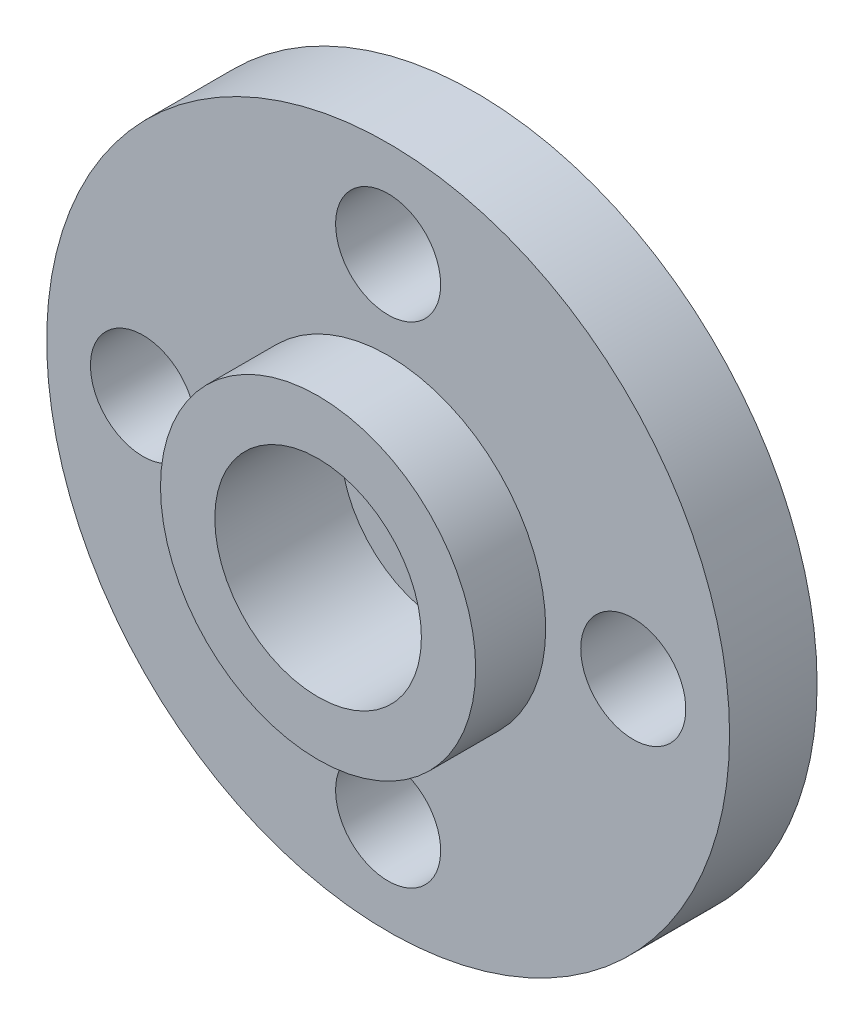
ISO-10303-21;
HEADER;
FILE_DESCRIPTION(('STEP AP214'),'2;1');
FILE_NAME('part.step','',(''),(''),'','','');
FILE_SCHEMA(('AUTOMOTIVE_DESIGN { 1 0 10303 214 1 1 1 1 }'));
ENDSEC;
DATA;
#1=APPLICATION_CONTEXT('core data for automotive mechanical design processes');
#2=APPLICATION_PROTOCOL_DEFINITION('international standard','automotive_design',2000,#1);
#3=PRODUCT_CONTEXT('',#1,'mechanical');
#4=PRODUCT('Part','Part','',(#3));
#5=PRODUCT_RELATED_PRODUCT_CATEGORY('part','',(#4));
#6=PRODUCT_DEFINITION_FORMATION('','',#4);
#7=PRODUCT_DEFINITION_CONTEXT('part definition',#1,'design');
#8=PRODUCT_DEFINITION('design','',#6,#7);
#9=PRODUCT_DEFINITION_SHAPE('','',#8);
#10=(LENGTH_UNIT() NAMED_UNIT(*) SI_UNIT(.MILLI.,.METRE.));
#11=(NAMED_UNIT(*) PLANE_ANGLE_UNIT() SI_UNIT($,.RADIAN.));
#12=(NAMED_UNIT(*) SI_UNIT($,.STERADIAN.) SOLID_ANGLE_UNIT());
#13=UNCERTAINTY_MEASURE_WITH_UNIT(LENGTH_MEASURE(1.E-05),#10,'distance_accuracy_value','');
#14=(GEOMETRIC_REPRESENTATION_CONTEXT(3) GLOBAL_UNCERTAINTY_ASSIGNED_CONTEXT((#13)) GLOBAL_UNIT_ASSIGNED_CONTEXT((#10,
#11,#12)) REPRESENTATION_CONTEXT('',''));
#15=CARTESIAN_POINT('',(0.,0.,0.));
#16=DIRECTION('',(0.,0.,1.));
#17=DIRECTION('',(1.,0.,0.));
#18=AXIS2_PLACEMENT_3D('',#15,#16,#17);
#19=CARTESIAN_POINT('',(0.,0.,2.5));
#20=DIRECTION('',(0.,0.,-1.));
#21=DIRECTION('',(-1.,0.,0.));
#22=AXIS2_PLACEMENT_3D('',#19,#20,#21);
#23=CYLINDRICAL_SURFACE('',#22,9.75);
#24=CARTESIAN_POINT('',(0.,0.,2.5));
#25=DIRECTION('',(0.,0.,1.));
#26=DIRECTION('',(1.,0.,0.));
#27=AXIS2_PLACEMENT_3D('',#24,#25,#26);
#28=CIRCLE('',#27,9.75);
#29=CARTESIAN_POINT('',(9.75,0.,2.5));
#30=VERTEX_POINT('',#29);
#31=EDGE_CURVE('E45',#30,#30,#28,.T.);
#32=ORIENTED_EDGE('',*,*,#31,.F.);
#33=EDGE_LOOP('',(#32));
#34=FACE_BOUND('',#33,.T.);
#35=CARTESIAN_POINT('',(0.,0.,0.));
#36=DIRECTION('',(0.,0.,1.));
#37=DIRECTION('',(1.,0.,0.));
#38=AXIS2_PLACEMENT_3D('',#35,#36,#37);
#39=CIRCLE('',#38,9.75);
#40=CARTESIAN_POINT('',(9.75,0.,0.));
#41=VERTEX_POINT('',#40);
#42=EDGE_CURVE('E51',#41,#41,#39,.T.);
#43=ORIENTED_EDGE('',*,*,#42,.T.);
#44=EDGE_LOOP('',(#43));
#45=FACE_BOUND('',#44,.T.);
#46=ADVANCED_FACE('F37',(#34,#45),#23,.T.);
#47=CARTESIAN_POINT('',(0.,0.,2.5));
#48=DIRECTION('',(0.,0.,1.));
#49=DIRECTION('',(1.,0.,0.));
#50=AXIS2_PLACEMENT_3D('',#47,#48,#49);
#51=PLANE('',#50);
#52=CARTESIAN_POINT('',(0.,-7.,2.5));
#53=DIRECTION('',(0.,0.,1.));
#54=DIRECTION('',(0.,1.,0.));
#55=AXIS2_PLACEMENT_3D('',#52,#53,#54);
#56=CIRCLE('',#55,1.5);
#57=CARTESIAN_POINT('',(0.,-5.5,2.5));
#58=VERTEX_POINT('',#57);
#59=EDGE_CURVE('E103',#58,#58,#56,.T.);
#60=ORIENTED_EDGE('',*,*,#59,.F.);
#61=EDGE_LOOP('',(#60));
#62=FACE_BOUND('',#61,.T.);
#63=CARTESIAN_POINT('',(7.,0.,2.5));
#64=DIRECTION('',(0.,0.,1.));
#65=DIRECTION('',(-1.,0.,0.));
#66=AXIS2_PLACEMENT_3D('',#63,#64,#65);
#67=CIRCLE('',#66,1.5);
#68=CARTESIAN_POINT('',(5.5,0.,2.5));
#69=VERTEX_POINT('',#68);
#70=EDGE_CURVE('E95',#69,#69,#67,.T.);
#71=ORIENTED_EDGE('',*,*,#70,.F.);
#72=EDGE_LOOP('',(#71));
#73=FACE_BOUND('',#72,.T.);
#74=CARTESIAN_POINT('',(0.,7.,2.5));
#75=DIRECTION('',(0.,0.,1.));
#76=DIRECTION('',(0.,-1.,0.));
#77=AXIS2_PLACEMENT_3D('',#74,#75,#76);
#78=CIRCLE('',#77,1.5);
#79=CARTESIAN_POINT('',(0.,5.5,2.5));
#80=VERTEX_POINT('',#79);
#81=EDGE_CURVE('E87',#80,#80,#78,.T.);
#82=ORIENTED_EDGE('',*,*,#81,.F.);
#83=EDGE_LOOP('',(#82));
#84=FACE_BOUND('',#83,.T.);
#85=CARTESIAN_POINT('',(-7.,0.,2.5));
#86=DIRECTION('',(0.,0.,1.));
#87=DIRECTION('',(1.,0.,0.));
#88=AXIS2_PLACEMENT_3D('',#85,#86,#87);
#89=CIRCLE('',#88,1.5);
#90=CARTESIAN_POINT('',(-5.5,0.,2.5));
#91=VERTEX_POINT('',#90);
#92=EDGE_CURVE('E79',#91,#91,#89,.T.);
#93=ORIENTED_EDGE('',*,*,#92,.F.);
#94=EDGE_LOOP('',(#93));
#95=FACE_BOUND('',#94,.T.);
#96=CARTESIAN_POINT('',(0.,0.,2.5));
#97=DIRECTION('',(0.,0.,1.));
#98=DIRECTION('',(1.,0.,0.));
#99=AXIS2_PLACEMENT_3D('',#96,#97,#98);
#100=CIRCLE('',#99,4.5);
#101=CARTESIAN_POINT('',(4.5,0.,2.5));
#102=VERTEX_POINT('',#101);
#103=EDGE_CURVE('E10',#102,#102,#100,.T.);
#104=ORIENTED_EDGE('',*,*,#103,.F.);
#105=EDGE_LOOP('',(#104));
#106=FACE_BOUND('',#105,.T.);
#107=ORIENTED_EDGE('',*,*,#31,.T.);
#108=EDGE_LOOP('',(#107));
#109=FACE_BOUND('',#108,.T.);
#110=ADVANCED_FACE('F121',(#62,#73,#84,#95,#106,#109),#51,.T.);
#111=CARTESIAN_POINT('',(0.,0.,0.));
#112=DIRECTION('',(0.,0.,1.));
#113=DIRECTION('',(1.,0.,0.));
#114=AXIS2_PLACEMENT_3D('',#111,#112,#113);
#115=PLANE('',#114);
#116=CARTESIAN_POINT('',(0.,-7.,0.));
#117=DIRECTION('',(0.,0.,1.));
#118=DIRECTION('',(0.,1.,0.));
#119=AXIS2_PLACEMENT_3D('',#116,#117,#118);
#120=CIRCLE('',#119,1.5);
#121=CARTESIAN_POINT('',(0.,-5.5,0.));
#122=VERTEX_POINT('',#121);
#123=EDGE_CURVE('E83',#122,#122,#120,.T.);
#124=ORIENTED_EDGE('',*,*,#123,.T.);
#125=EDGE_LOOP('',(#124));
#126=FACE_BOUND('',#125,.T.);
#127=CARTESIAN_POINT('',(7.,0.,0.));
#128=DIRECTION('',(0.,0.,1.));
#129=DIRECTION('',(-1.,0.,0.));
#130=AXIS2_PLACEMENT_3D('',#127,#128,#129);
#131=CIRCLE('',#130,1.5);
#132=CARTESIAN_POINT('',(5.5,0.,0.));
#133=VERTEX_POINT('',#132);
#134=EDGE_CURVE('E99',#133,#133,#131,.T.);
#135=ORIENTED_EDGE('',*,*,#134,.T.);
#136=EDGE_LOOP('',(#135));
#137=FACE_BOUND('',#136,.T.);
#138=CARTESIAN_POINT('',(0.,7.,0.));
#139=DIRECTION('',(0.,0.,1.));
#140=DIRECTION('',(0.,-1.,0.));
#141=AXIS2_PLACEMENT_3D('',#138,#139,#140);
#142=CIRCLE('',#141,1.5);
#143=CARTESIAN_POINT('',(0.,5.5,0.));
#144=VERTEX_POINT('',#143);
#145=EDGE_CURVE('E91',#144,#144,#142,.T.);
#146=ORIENTED_EDGE('',*,*,#145,.T.);
#147=EDGE_LOOP('',(#146));
#148=FACE_BOUND('',#147,.T.);
#149=CARTESIAN_POINT('',(-7.,0.,0.));
#150=DIRECTION('',(0.,0.,1.));
#151=DIRECTION('',(1.,0.,0.));
#152=AXIS2_PLACEMENT_3D('',#149,#150,#151);
#153=CIRCLE('',#152,1.5);
#154=CARTESIAN_POINT('',(-5.5,0.,0.));
#155=VERTEX_POINT('',#154);
#156=EDGE_CURVE('E78',#155,#155,#153,.T.);
#157=ORIENTED_EDGE('',*,*,#156,.T.);
#158=EDGE_LOOP('',(#157));
#159=FACE_BOUND('',#158,.T.);
#160=CARTESIAN_POINT('',(0.,0.,0.));
#161=DIRECTION('',(0.,0.,-1.));
#162=DIRECTION('',(-1.,0.,0.));
#163=AXIS2_PLACEMENT_3D('',#160,#161,#162);
#164=CIRCLE('',#163,1.6);
#165=CARTESIAN_POINT('',(-1.6,0.,0.));
#166=VERTEX_POINT('',#165);
#167=EDGE_CURVE('E74',#166,#166,#164,.T.);
#168=ORIENTED_EDGE('',*,*,#167,.F.);
#169=EDGE_LOOP('',(#168));
#170=FACE_BOUND('',#169,.T.);
#171=ORIENTED_EDGE('',*,*,#42,.F.);
#172=EDGE_LOOP('',(#171));
#173=FACE_BOUND('',#172,.T.);
#174=ADVANCED_FACE('F111',(#126,#137,#148,#159,#170,#173),#115,.F.);
#175=CARTESIAN_POINT('',(0.,0.,4.5));
#176=DIRECTION('',(0.,0.,-1.));
#177=DIRECTION('',(-1.,0.,0.));
#178=AXIS2_PLACEMENT_3D('',#175,#176,#177);
#179=CYLINDRICAL_SURFACE('',#178,4.5);
#180=CARTESIAN_POINT('',(0.,0.,4.5));
#181=DIRECTION('',(0.,0.,1.));
#182=DIRECTION('',(1.,0.,0.));
#183=AXIS2_PLACEMENT_3D('',#180,#181,#182);
#184=CIRCLE('',#183,4.5);
#185=CARTESIAN_POINT('',(4.5,0.,4.5));
#186=VERTEX_POINT('',#185);
#187=EDGE_CURVE('E54',#186,#186,#184,.T.);
#188=ORIENTED_EDGE('',*,*,#187,.F.);
#189=EDGE_LOOP('',(#188));
#190=FACE_BOUND('',#189,.T.);
#191=ORIENTED_EDGE('',*,*,#103,.T.);
#192=EDGE_LOOP('',(#191));
#193=FACE_BOUND('',#192,.T.);
#194=ADVANCED_FACE('F149',(#190,#193),#179,.T.);
#195=CARTESIAN_POINT('',(0.,0.,4.5));
#196=DIRECTION('',(0.,0.,1.));
#197=DIRECTION('',(1.,0.,0.));
#198=AXIS2_PLACEMENT_3D('',#195,#196,#197);
#199=PLANE('',#198);
#200=CARTESIAN_POINT('',(0.,0.,4.5));
#201=DIRECTION('',(0.,0.,1.));
#202=DIRECTION('',(1.,0.,0.));
#203=AXIS2_PLACEMENT_3D('',#200,#201,#202);
#204=CIRCLE('',#203,2.95);
#205=CARTESIAN_POINT('',(2.95,0.,4.5));
#206=VERTEX_POINT('',#205);
#207=EDGE_CURVE('E67',#206,#206,#204,.T.);
#208=ORIENTED_EDGE('',*,*,#207,.F.);
#209=EDGE_LOOP('',(#208));
#210=FACE_BOUND('',#209,.T.);
#211=ORIENTED_EDGE('',*,*,#187,.T.);
#212=EDGE_LOOP('',(#211));
#213=FACE_BOUND('',#212,.T.);
#214=ADVANCED_FACE('F155',(#210,#213),#199,.T.);
#215=CARTESIAN_POINT('',(0.,0.,0.900000000000001));
#216=DIRECTION('',(0.,0.,1.));
#217=DIRECTION('',(1.,0.,0.));
#218=AXIS2_PLACEMENT_3D('',#215,#216,#217);
#219=CYLINDRICAL_SURFACE('',#218,2.95);
#220=CARTESIAN_POINT('',(0.,0.,0.900000000000001));
#221=DIRECTION('',(0.,0.,1.));
#222=DIRECTION('',(1.,0.,0.));
#223=AXIS2_PLACEMENT_3D('',#220,#221,#222);
#224=CIRCLE('',#223,2.95);
#225=CARTESIAN_POINT('',(2.95,0.,0.900000000000001));
#226=VERTEX_POINT('',#225);
#227=EDGE_CURVE('E62',#226,#226,#224,.T.);
#228=ORIENTED_EDGE('',*,*,#227,.F.);
#229=EDGE_LOOP('',(#228));
#230=FACE_BOUND('',#229,.T.);
#231=ORIENTED_EDGE('',*,*,#207,.T.);
#232=EDGE_LOOP('',(#231));
#233=FACE_BOUND('',#232,.T.);
#234=ADVANCED_FACE('F163',(#230,#233),#219,.F.);
#235=CARTESIAN_POINT('',(0.,0.,0.900000000000001));
#236=DIRECTION('',(0.,0.,1.));
#237=DIRECTION('',(1.,0.,0.));
#238=AXIS2_PLACEMENT_3D('',#235,#236,#237);
#239=PLANE('',#238);
#240=CARTESIAN_POINT('',(0.,0.,0.900000000000001));
#241=DIRECTION('',(0.,0.,1.));
#242=DIRECTION('',(1.,0.,0.));
#243=AXIS2_PLACEMENT_3D('',#240,#241,#242);
#244=CIRCLE('',#243,1.6);
#245=CARTESIAN_POINT('',(1.6,0.,0.900000000000001));
#246=VERTEX_POINT('',#245);
#247=EDGE_CURVE('E40',#246,#246,#244,.T.);
#248=ORIENTED_EDGE('',*,*,#247,.F.);
#249=EDGE_LOOP('',(#248));
#250=FACE_BOUND('',#249,.T.);
#251=ORIENTED_EDGE('',*,*,#227,.T.);
#252=EDGE_LOOP('',(#251));
#253=FACE_BOUND('',#252,.T.);
#254=ADVANCED_FACE('F171',(#250,#253),#239,.T.);
#255=CARTESIAN_POINT('',(0.,0.,3.6));
#256=DIRECTION('',(0.,0.,-1.));
#257=DIRECTION('',(-1.,0.,0.));
#258=AXIS2_PLACEMENT_3D('',#255,#256,#257);
#259=CYLINDRICAL_SURFACE('',#258,1.6);
#260=ORIENTED_EDGE('',*,*,#247,.T.);
#261=EDGE_LOOP('',(#260));
#262=FACE_BOUND('',#261,.T.);
#263=ORIENTED_EDGE('',*,*,#167,.T.);
#264=EDGE_LOOP('',(#263));
#265=FACE_BOUND('',#264,.T.);
#266=ADVANCED_FACE('F179',(#262,#265),#259,.F.);
#267=CARTESIAN_POINT('',(-7.,0.,0.));
#268=DIRECTION('',(0.,0.,1.));
#269=DIRECTION('',(1.,0.,0.));
#270=AXIS2_PLACEMENT_3D('',#267,#268,#269);
#271=CYLINDRICAL_SURFACE('',#270,1.5);
#272=ORIENTED_EDGE('',*,*,#156,.F.);
#273=EDGE_LOOP('',(#272));
#274=FACE_BOUND('',#273,.T.);
#275=ORIENTED_EDGE('',*,*,#92,.T.);
#276=EDGE_LOOP('',(#275));
#277=FACE_BOUND('',#276,.T.);
#278=ADVANCED_FACE('F187',(#274,#277),#271,.F.);
#279=CARTESIAN_POINT('',(0.,7.,0.));
#280=DIRECTION('',(0.,0.,1.));
#281=DIRECTION('',(1.,0.,0.));
#282=AXIS2_PLACEMENT_3D('',#279,#280,#281);
#283=CYLINDRICAL_SURFACE('',#282,1.5);
#284=ORIENTED_EDGE('',*,*,#145,.F.);
#285=EDGE_LOOP('',(#284));
#286=FACE_BOUND('',#285,.T.);
#287=ORIENTED_EDGE('',*,*,#81,.T.);
#288=EDGE_LOOP('',(#287));
#289=FACE_BOUND('',#288,.T.);
#290=ADVANCED_FACE('F194',(#286,#289),#283,.F.);
#291=CARTESIAN_POINT('',(7.,0.,0.));
#292=DIRECTION('',(0.,0.,1.));
#293=DIRECTION('',(1.,0.,0.));
#294=AXIS2_PLACEMENT_3D('',#291,#292,#293);
#295=CYLINDRICAL_SURFACE('',#294,1.5);
#296=ORIENTED_EDGE('',*,*,#134,.F.);
#297=EDGE_LOOP('',(#296));
#298=FACE_BOUND('',#297,.T.);
#299=ORIENTED_EDGE('',*,*,#70,.T.);
#300=EDGE_LOOP('',(#299));
#301=FACE_BOUND('',#300,.T.);
#302=ADVANCED_FACE('F117',(#298,#301),#295,.F.);
#303=CARTESIAN_POINT('',(0.,-7.,0.));
#304=DIRECTION('',(0.,0.,1.));
#305=DIRECTION('',(1.,0.,0.));
#306=AXIS2_PLACEMENT_3D('',#303,#304,#305);
#307=CYLINDRICAL_SURFACE('',#306,1.5);
#308=ORIENTED_EDGE('',*,*,#123,.F.);
#309=EDGE_LOOP('',(#308));
#310=FACE_BOUND('',#309,.T.);
#311=ORIENTED_EDGE('',*,*,#59,.T.);
#312=EDGE_LOOP('',(#311));
#313=FACE_BOUND('',#312,.T.);
#314=ADVANCED_FACE('F114',(#310,#313),#307,.F.);
#315=CLOSED_SHELL('',(#46,#110,#174,#194,#214,#234,#254,#266,#278,#290,#302,#314));
#316=MANIFOLD_SOLID_BREP('B2',#315);
#317=ADVANCED_BREP_SHAPE_REPRESENTATION('',(#18,#316),#14);
#318=SHAPE_DEFINITION_REPRESENTATION(#9,#317);
ENDSEC;
END-ISO-10303-21;
